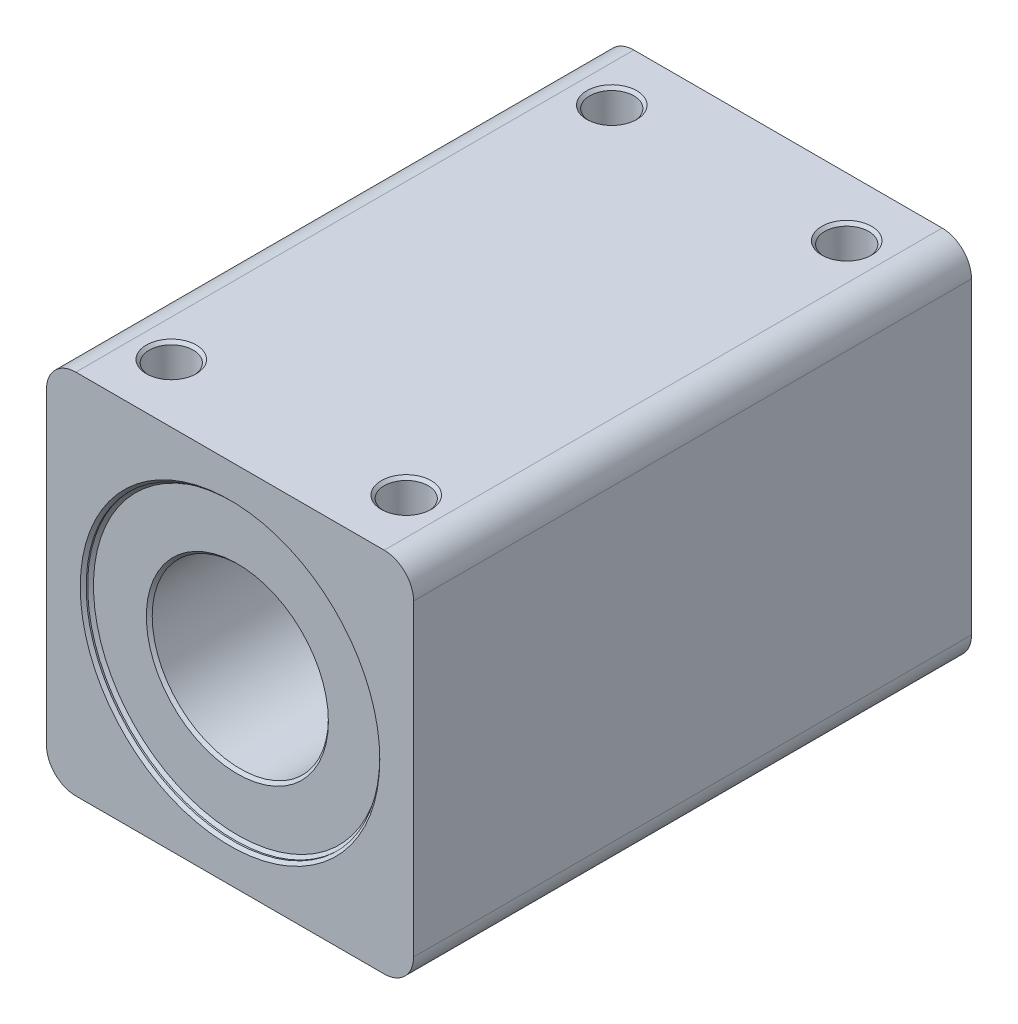
ISO-10303-21;
HEADER;
FILE_DESCRIPTION(('STEP AP214'),'2;1');
FILE_NAME('part.step','',(''),(''),'','','');
FILE_SCHEMA(('AUTOMOTIVE_DESIGN { 1 0 10303 214 1 1 1 1 }'));
ENDSEC;
DATA;
#1=APPLICATION_CONTEXT('core data for automotive mechanical design processes');
#2=APPLICATION_PROTOCOL_DEFINITION('international standard','automotive_design',2000,#1);
#3=PRODUCT_CONTEXT('',#1,'mechanical');
#4=PRODUCT('Part','Part','',(#3));
#5=PRODUCT_RELATED_PRODUCT_CATEGORY('part','',(#4));
#6=PRODUCT_DEFINITION_FORMATION('','',#4);
#7=PRODUCT_DEFINITION_CONTEXT('part definition',#1,'design');
#8=PRODUCT_DEFINITION('design','',#6,#7);
#9=PRODUCT_DEFINITION_SHAPE('','',#8);
#10=(LENGTH_UNIT() NAMED_UNIT(*) SI_UNIT(.MILLI.,.METRE.));
#11=(NAMED_UNIT(*) PLANE_ANGLE_UNIT() SI_UNIT($,.RADIAN.));
#12=(NAMED_UNIT(*) SI_UNIT($,.STERADIAN.) SOLID_ANGLE_UNIT());
#13=UNCERTAINTY_MEASURE_WITH_UNIT(LENGTH_MEASURE(1.E-05),#10,'distance_accuracy_value','');
#14=(GEOMETRIC_REPRESENTATION_CONTEXT(3) GLOBAL_UNCERTAINTY_ASSIGNED_CONTEXT((#13)) GLOBAL_UNIT_ASSIGNED_CONTEXT((#10,
#11,#12)) REPRESENTATION_CONTEXT('',''));
#15=CARTESIAN_POINT('',(0.,0.,0.));
#16=DIRECTION('',(0.,0.,1.));
#17=DIRECTION('',(1.,0.,0.));
#18=AXIS2_PLACEMENT_3D('',#15,#16,#17);
#19=CARTESIAN_POINT('',(0.,0.,19.));
#20=DIRECTION('',(0.,0.,-1.));
#21=DIRECTION('',(-1.,0.,0.));
#22=AXIS2_PLACEMENT_3D('',#19,#20,#21);
#23=CYLINDRICAL_SURFACE('',#22,6.);
#24=CARTESIAN_POINT('',(0.,0.,-18.3));
#25=DIRECTION('',(0.,0.,-1.));
#26=DIRECTION('',(-1.,0.,0.));
#27=AXIS2_PLACEMENT_3D('',#24,#25,#26);
#28=CIRCLE('',#27,6.);
#29=CARTESIAN_POINT('',(-6.,0.,-18.3));
#30=VERTEX_POINT('',#29);
#31=EDGE_CURVE('E162',#30,#30,#28,.T.);
#32=ORIENTED_EDGE('',*,*,#31,.T.);
#33=EDGE_LOOP('',(#32));
#34=FACE_BOUND('',#33,.T.);
#35=CARTESIAN_POINT('',(0.,0.,18.3));
#36=DIRECTION('',(0.,0.,1.));
#37=DIRECTION('',(1.,0.,0.));
#38=AXIS2_PLACEMENT_3D('',#35,#36,#37);
#39=CIRCLE('',#38,6.);
#40=CARTESIAN_POINT('',(6.,0.,18.3));
#41=VERTEX_POINT('',#40);
#42=EDGE_CURVE('E159',#41,#41,#39,.T.);
#43=ORIENTED_EDGE('',*,*,#42,.T.);
#44=EDGE_LOOP('',(#43));
#45=FACE_BOUND('',#44,.T.);
#46=ADVANCED_FACE('F33',(#34,#45),#23,.F.);
#47=CARTESIAN_POINT('',(-12.5,-12.5,19.));
#48=DIRECTION('',(0.,0.,1.));
#49=DIRECTION('',(1.,0.,0.));
#50=AXIS2_PLACEMENT_3D('',#47,#48,#49);
#51=PLANE('',#50);
#52=CARTESIAN_POINT('',(0.,0.,19.));
#53=DIRECTION('',(0.,0.,1.));
#54=DIRECTION('',(1.,0.,0.));
#55=AXIS2_PLACEMENT_3D('',#52,#53,#54);
#56=CIRCLE('',#55,10.2);
#57=CARTESIAN_POINT('',(10.2,0.,19.));
#58=VERTEX_POINT('',#57);
#59=EDGE_CURVE('E41',#58,#58,#56,.F.);
#60=ORIENTED_EDGE('',*,*,#59,.T.);
#61=EDGE_LOOP('',(#60));
#62=FACE_BOUND('',#61,.T.);
#63=DIRECTION('',(0.,1.,0.));
#64=VECTOR('',#63,1.);
#65=CARTESIAN_POINT('',(12.5,12.5,19.));
#66=LINE('',#65,#64);
#67=CARTESIAN_POINT('',(12.5,-10.5,19.));
#68=VERTEX_POINT('',#67);
#69=CARTESIAN_POINT('',(12.5,10.5,19.));
#70=VERTEX_POINT('',#69);
#71=EDGE_CURVE('E334',#68,#70,#66,.T.);
#72=ORIENTED_EDGE('',*,*,#71,.T.);
#73=CARTESIAN_POINT('',(10.5,10.5,19.));
#74=DIRECTION('',(0.,0.,1.));
#75=DIRECTION('',(1.,0.,0.));
#76=AXIS2_PLACEMENT_3D('',#73,#74,#75);
#77=CIRCLE('',#76,2.);
#78=CARTESIAN_POINT('',(10.5,12.5,19.));
#79=VERTEX_POINT('',#78);
#80=EDGE_CURVE('E148',#70,#79,#77,.T.);
#81=ORIENTED_EDGE('',*,*,#80,.T.);
#82=DIRECTION('',(-1.,0.,0.));
#83=VECTOR('',#82,1.);
#84=CARTESIAN_POINT('',(-12.5,12.5,19.));
#85=LINE('',#84,#83);
#86=CARTESIAN_POINT('',(-10.5,12.5,19.));
#87=VERTEX_POINT('',#86);
#88=EDGE_CURVE('E120',#79,#87,#85,.T.);
#89=ORIENTED_EDGE('',*,*,#88,.T.);
#90=CARTESIAN_POINT('',(-10.5,10.5,19.));
#91=DIRECTION('',(0.,0.,1.));
#92=DIRECTION('',(1.,0.,0.));
#93=AXIS2_PLACEMENT_3D('',#90,#91,#92);
#94=CIRCLE('',#93,2.);
#95=CARTESIAN_POINT('',(-12.5,10.5,19.));
#96=VERTEX_POINT('',#95);
#97=EDGE_CURVE('E144',#87,#96,#94,.T.);
#98=ORIENTED_EDGE('',*,*,#97,.T.);
#99=DIRECTION('',(0.,-1.,0.));
#100=VECTOR('',#99,1.);
#101=CARTESIAN_POINT('',(-12.5,12.5,19.));
#102=LINE('',#101,#100);
#103=CARTESIAN_POINT('',(-12.5,-10.5,19.));
#104=VERTEX_POINT('',#103);
#105=EDGE_CURVE('E127',#96,#104,#102,.T.);
#106=ORIENTED_EDGE('',*,*,#105,.T.);
#107=CARTESIAN_POINT('',(-10.5,-10.5,19.));
#108=DIRECTION('',(0.,0.,1.));
#109=DIRECTION('',(1.,0.,0.));
#110=AXIS2_PLACEMENT_3D('',#107,#108,#109);
#111=CIRCLE('',#110,2.);
#112=CARTESIAN_POINT('',(-10.5,-12.5,19.));
#113=VERTEX_POINT('',#112);
#114=EDGE_CURVE('E55',#104,#113,#111,.T.);
#115=ORIENTED_EDGE('',*,*,#114,.T.);
#116=DIRECTION('',(1.,0.,0.));
#117=VECTOR('',#116,1.);
#118=CARTESIAN_POINT('',(-12.5,-12.5,19.));
#119=LINE('',#118,#117);
#120=CARTESIAN_POINT('',(10.5,-12.5,19.));
#121=VERTEX_POINT('',#120);
#122=EDGE_CURVE('E130',#113,#121,#119,.T.);
#123=ORIENTED_EDGE('',*,*,#122,.T.);
#124=CARTESIAN_POINT('',(10.5,-10.5,19.));
#125=DIRECTION('',(0.,0.,1.));
#126=DIRECTION('',(1.,0.,0.));
#127=AXIS2_PLACEMENT_3D('',#124,#125,#126);
#128=CIRCLE('',#127,2.);
#129=EDGE_CURVE('E146',#121,#68,#128,.T.);
#130=ORIENTED_EDGE('',*,*,#129,.T.);
#131=EDGE_LOOP('',(#72,#81,#89,#98,#106,#115,#123,#130));
#132=FACE_BOUND('',#131,.T.);
#133=ADVANCED_FACE('F215',(#62,#132),#51,.T.);
#134=CARTESIAN_POINT('',(-12.5,-12.5,-19.));
#135=DIRECTION('',(0.,0.,1.));
#136=DIRECTION('',(1.,0.,0.));
#137=AXIS2_PLACEMENT_3D('',#134,#135,#136);
#138=PLANE('',#137);
#139=CARTESIAN_POINT('',(0.,0.,-19.));
#140=DIRECTION('',(0.,0.,1.));
#141=DIRECTION('',(1.,0.,0.));
#142=AXIS2_PLACEMENT_3D('',#139,#140,#141);
#143=CIRCLE('',#142,10.2);
#144=CARTESIAN_POINT('',(10.2,0.,-19.));
#145=VERTEX_POINT('',#144);
#146=EDGE_CURVE('E11',#145,#145,#143,.T.);
#147=ORIENTED_EDGE('',*,*,#146,.T.);
#148=EDGE_LOOP('',(#147));
#149=FACE_BOUND('',#148,.T.);
#150=DIRECTION('',(-1.,0.,0.));
#151=VECTOR('',#150,1.);
#152=CARTESIAN_POINT('',(-12.5,12.5,-19.));
#153=LINE('',#152,#151);
#154=CARTESIAN_POINT('',(10.5,12.5,-19.));
#155=VERTEX_POINT('',#154);
#156=CARTESIAN_POINT('',(-10.5,12.5,-19.));
#157=VERTEX_POINT('',#156);
#158=EDGE_CURVE('E117',#155,#157,#153,.T.);
#159=ORIENTED_EDGE('',*,*,#158,.F.);
#160=CARTESIAN_POINT('',(10.5,10.5,-19.));
#161=DIRECTION('',(0.,0.,1.));
#162=DIRECTION('',(1.,0.,0.));
#163=AXIS2_PLACEMENT_3D('',#160,#161,#162);
#164=CIRCLE('',#163,2.);
#165=CARTESIAN_POINT('',(12.5,10.5,-19.));
#166=VERTEX_POINT('',#165);
#167=EDGE_CURVE('E100',#155,#166,#164,.F.);
#168=ORIENTED_EDGE('',*,*,#167,.T.);
#169=DIRECTION('',(0.,1.,0.));
#170=VECTOR('',#169,1.);
#171=CARTESIAN_POINT('',(12.5,12.5,-19.));
#172=LINE('',#171,#170);
#173=CARTESIAN_POINT('',(12.5,-10.5,-19.));
#174=VERTEX_POINT('',#173);
#175=EDGE_CURVE('E128',#174,#166,#172,.T.);
#176=ORIENTED_EDGE('',*,*,#175,.F.);
#177=CARTESIAN_POINT('',(10.5,-10.5,-19.));
#178=DIRECTION('',(0.,0.,1.));
#179=DIRECTION('',(1.,0.,0.));
#180=AXIS2_PLACEMENT_3D('',#177,#178,#179);
#181=CIRCLE('',#180,2.);
#182=CARTESIAN_POINT('',(10.5,-12.5,-19.));
#183=VERTEX_POINT('',#182);
#184=EDGE_CURVE('E111',#174,#183,#181,.F.);
#185=ORIENTED_EDGE('',*,*,#184,.T.);
#186=DIRECTION('',(1.,0.,0.));
#187=VECTOR('',#186,1.);
#188=CARTESIAN_POINT('',(-12.5,-12.5,-19.));
#189=LINE('',#188,#187);
#190=CARTESIAN_POINT('',(-10.5,-12.5,-19.));
#191=VERTEX_POINT('',#190);
#192=EDGE_CURVE('E132',#191,#183,#189,.T.);
#193=ORIENTED_EDGE('',*,*,#192,.F.);
#194=CARTESIAN_POINT('',(-10.5,-10.5,-19.));
#195=DIRECTION('',(0.,0.,1.));
#196=DIRECTION('',(1.,0.,0.));
#197=AXIS2_PLACEMENT_3D('',#194,#195,#196);
#198=CIRCLE('',#197,2.);
#199=CARTESIAN_POINT('',(-12.5,-10.5,-19.));
#200=VERTEX_POINT('',#199);
#201=EDGE_CURVE('E121',#191,#200,#198,.F.);
#202=ORIENTED_EDGE('',*,*,#201,.T.);
#203=DIRECTION('',(0.,-1.,0.));
#204=VECTOR('',#203,1.);
#205=CARTESIAN_POINT('',(-12.5,12.5,-19.));
#206=LINE('',#205,#204);
#207=CARTESIAN_POINT('',(-12.5,10.5,-19.));
#208=VERTEX_POINT('',#207);
#209=EDGE_CURVE('E321',#208,#200,#206,.T.);
#210=ORIENTED_EDGE('',*,*,#209,.F.);
#211=CARTESIAN_POINT('',(-10.5,10.5,-19.));
#212=DIRECTION('',(0.,0.,1.));
#213=DIRECTION('',(1.,0.,0.));
#214=AXIS2_PLACEMENT_3D('',#211,#212,#213);
#215=CIRCLE('',#214,2.);
#216=EDGE_CURVE('E126',#208,#157,#215,.F.);
#217=ORIENTED_EDGE('',*,*,#216,.T.);
#218=EDGE_LOOP('',(#159,#168,#176,#185,#193,#202,#210,#217));
#219=FACE_BOUND('',#218,.T.);
#220=ADVANCED_FACE('F124',(#149,#219),#138,.F.);
#221=CARTESIAN_POINT('',(-12.5,12.5,19.));
#222=DIRECTION('',(1.,0.,0.));
#223=DIRECTION('',(0.,1.,0.));
#224=AXIS2_PLACEMENT_3D('',#221,#222,#223);
#225=PLANE('',#224);
#226=ORIENTED_EDGE('',*,*,#105,.F.);
#227=DIRECTION('',(0.,0.,-1.));
#228=VECTOR('',#227,1.);
#229=CARTESIAN_POINT('',(-12.5,10.5,19.));
#230=LINE('',#229,#228);
#231=EDGE_CURVE('E156',#96,#208,#230,.T.);
#232=ORIENTED_EDGE('',*,*,#231,.T.);
#233=ORIENTED_EDGE('',*,*,#209,.T.);
#234=DIRECTION('',(0.,0.,-1.));
#235=VECTOR('',#234,1.);
#236=CARTESIAN_POINT('',(-12.5,-10.5,19.));
#237=LINE('',#236,#235);
#238=EDGE_CURVE('E154',#200,#104,#237,.F.);
#239=ORIENTED_EDGE('',*,*,#238,.T.);
#240=EDGE_LOOP('',(#226,#232,#233,#239));
#241=FACE_BOUND('',#240,.T.);
#242=ADVANCED_FACE('F248',(#241),#225,.F.);
#243=CARTESIAN_POINT('',(-12.5,-12.5,19.));
#244=DIRECTION('',(0.,1.,0.));
#245=DIRECTION('',(0.,0.,1.));
#246=AXIS2_PLACEMENT_3D('',#243,#244,#245);
#247=PLANE('',#246);
#248=ORIENTED_EDGE('',*,*,#192,.T.);
#249=DIRECTION('',(0.,0.,-1.));
#250=VECTOR('',#249,1.);
#251=CARTESIAN_POINT('',(10.5,-12.5,19.));
#252=LINE('',#251,#250);
#253=EDGE_CURVE('E48',#183,#121,#252,.F.);
#254=ORIENTED_EDGE('',*,*,#253,.T.);
#255=ORIENTED_EDGE('',*,*,#122,.F.);
#256=DIRECTION('',(0.,0.,-1.));
#257=VECTOR('',#256,1.);
#258=CARTESIAN_POINT('',(-10.5,-12.5,19.));
#259=LINE('',#258,#257);
#260=EDGE_CURVE('E150',#113,#191,#259,.T.);
#261=ORIENTED_EDGE('',*,*,#260,.T.);
#262=EDGE_LOOP('',(#248,#254,#255,#261));
#263=FACE_BOUND('',#262,.T.);
#264=ADVANCED_FACE('F253',(#263),#247,.F.);
#265=CARTESIAN_POINT('',(12.5,12.5,19.));
#266=DIRECTION('',(-1.,0.,0.));
#267=DIRECTION('',(0.,-1.,0.));
#268=AXIS2_PLACEMENT_3D('',#265,#266,#267);
#269=PLANE('',#268);
#270=ORIENTED_EDGE('',*,*,#175,.T.);
#271=DIRECTION('',(0.,0.,-1.));
#272=VECTOR('',#271,1.);
#273=CARTESIAN_POINT('',(12.5,10.5,19.));
#274=LINE('',#273,#272);
#275=EDGE_CURVE('E105',#166,#70,#274,.F.);
#276=ORIENTED_EDGE('',*,*,#275,.T.);
#277=ORIENTED_EDGE('',*,*,#71,.F.);
#278=DIRECTION('',(0.,0.,-1.));
#279=VECTOR('',#278,1.);
#280=CARTESIAN_POINT('',(12.5,-10.5,19.));
#281=LINE('',#280,#279);
#282=EDGE_CURVE('E110',#68,#174,#281,.T.);
#283=ORIENTED_EDGE('',*,*,#282,.T.);
#284=EDGE_LOOP('',(#270,#276,#277,#283));
#285=FACE_BOUND('',#284,.T.);
#286=ADVANCED_FACE('F235',(#285),#269,.F.);
#287=CARTESIAN_POINT('',(-12.5,12.5,19.));
#288=DIRECTION('',(0.,-1.,0.));
#289=DIRECTION('',(0.,0.,-1.));
#290=AXIS2_PLACEMENT_3D('',#287,#288,#289);
#291=PLANE('',#290);
#292=CARTESIAN_POINT('',(-8.,12.5,15.));
#293=DIRECTION('',(0.,-1.,0.));
#294=DIRECTION('',(0.,0.,-1.));
#295=AXIS2_PLACEMENT_3D('',#292,#293,#294);
#296=CIRCLE('',#295,1.7);
#297=CARTESIAN_POINT('',(-8.,12.5,13.3));
#298=VERTEX_POINT('',#297);
#299=EDGE_CURVE('E201',#298,#298,#296,.T.);
#300=ORIENTED_EDGE('',*,*,#299,.T.);
#301=EDGE_LOOP('',(#300));
#302=FACE_BOUND('',#301,.T.);
#303=CARTESIAN_POINT('',(-8.,12.5,-15.));
#304=DIRECTION('',(0.,-1.,0.));
#305=DIRECTION('',(0.,0.,-1.));
#306=AXIS2_PLACEMENT_3D('',#303,#304,#305);
#307=CIRCLE('',#306,1.7);
#308=CARTESIAN_POINT('',(-8.,12.5,-16.7));
#309=VERTEX_POINT('',#308);
#310=EDGE_CURVE('E198',#309,#309,#307,.T.);
#311=ORIENTED_EDGE('',*,*,#310,.T.);
#312=EDGE_LOOP('',(#311));
#313=FACE_BOUND('',#312,.T.);
#314=CARTESIAN_POINT('',(8.,12.5,-15.));
#315=DIRECTION('',(0.,-1.,0.));
#316=DIRECTION('',(0.,0.,-1.));
#317=AXIS2_PLACEMENT_3D('',#314,#315,#316);
#318=CIRCLE('',#317,1.7);
#319=CARTESIAN_POINT('',(8.,12.5,-16.7));
#320=VERTEX_POINT('',#319);
#321=EDGE_CURVE('E195',#320,#320,#318,.T.);
#322=ORIENTED_EDGE('',*,*,#321,.T.);
#323=EDGE_LOOP('',(#322));
#324=FACE_BOUND('',#323,.T.);
#325=CARTESIAN_POINT('',(8.,12.5,15.));
#326=DIRECTION('',(0.,-1.,0.));
#327=DIRECTION('',(0.,0.,-1.));
#328=AXIS2_PLACEMENT_3D('',#325,#326,#327);
#329=CIRCLE('',#328,1.7);
#330=CARTESIAN_POINT('',(8.,12.5,13.3));
#331=VERTEX_POINT('',#330);
#332=EDGE_CURVE('E192',#331,#331,#329,.T.);
#333=ORIENTED_EDGE('',*,*,#332,.T.);
#334=EDGE_LOOP('',(#333));
#335=FACE_BOUND('',#334,.T.);
#336=ORIENTED_EDGE('',*,*,#88,.F.);
#337=DIRECTION('',(0.,0.,-1.));
#338=VECTOR('',#337,1.);
#339=CARTESIAN_POINT('',(10.5,12.5,19.));
#340=LINE('',#339,#338);
#341=EDGE_CURVE('E104',#79,#155,#340,.T.);
#342=ORIENTED_EDGE('',*,*,#341,.T.);
#343=ORIENTED_EDGE('',*,*,#158,.T.);
#344=DIRECTION('',(0.,0.,-1.));
#345=VECTOR('',#344,1.);
#346=CARTESIAN_POINT('',(-10.5,12.5,19.));
#347=LINE('',#346,#345);
#348=EDGE_CURVE('E122',#157,#87,#347,.F.);
#349=ORIENTED_EDGE('',*,*,#348,.T.);
#350=EDGE_LOOP('',(#336,#342,#343,#349));
#351=FACE_BOUND('',#350,.T.);
#352=ADVANCED_FACE('F116',(#302,#313,#324,#335,#351),#291,.F.);
#353=CARTESIAN_POINT('',(0.,0.,18.5));
#354=DIRECTION('',(0.,0.,1.));
#355=DIRECTION('',(1.,0.,0.));
#356=AXIS2_PLACEMENT_3D('',#353,#354,#355);
#357=CYLINDRICAL_SURFACE('',#356,10.);
#358=CARTESIAN_POINT('',(0.,0.,18.7));
#359=DIRECTION('',(0.,0.,1.));
#360=DIRECTION('',(1.,0.,0.));
#361=AXIS2_PLACEMENT_3D('',#358,#359,#360);
#362=CIRCLE('',#361,10.);
#363=CARTESIAN_POINT('',(10.,0.,18.7));
#364=VERTEX_POINT('',#363);
#365=EDGE_CURVE('E186',#364,#364,#362,.F.);
#366=ORIENTED_EDGE('',*,*,#365,.T.);
#367=EDGE_LOOP('',(#366));
#368=FACE_BOUND('',#367,.T.);
#369=CARTESIAN_POINT('',(0.,0.,18.8));
#370=DIRECTION('',(0.,0.,1.));
#371=DIRECTION('',(1.,0.,0.));
#372=AXIS2_PLACEMENT_3D('',#369,#370,#371);
#373=CIRCLE('',#372,10.);
#374=CARTESIAN_POINT('',(10.,0.,18.8));
#375=VERTEX_POINT('',#374);
#376=EDGE_CURVE('E183',#375,#375,#373,.T.);
#377=ORIENTED_EDGE('',*,*,#376,.T.);
#378=EDGE_LOOP('',(#377));
#379=FACE_BOUND('',#378,.T.);
#380=ADVANCED_FACE('F223',(#368,#379),#357,.F.);
#381=CARTESIAN_POINT('',(0.,0.,18.5));
#382=DIRECTION('',(0.,0.,1.));
#383=DIRECTION('',(1.,0.,0.));
#384=AXIS2_PLACEMENT_3D('',#381,#382,#383);
#385=PLANE('',#384);
#386=CARTESIAN_POINT('',(0.,0.,18.5));
#387=DIRECTION('',(0.,0.,1.));
#388=DIRECTION('',(1.,0.,0.));
#389=AXIS2_PLACEMENT_3D('',#386,#387,#388);
#390=CIRCLE('',#389,6.2);
#391=CARTESIAN_POINT('',(6.2,0.,18.5));
#392=VERTEX_POINT('',#391);
#393=EDGE_CURVE('E174',#392,#392,#390,.F.);
#394=ORIENTED_EDGE('',*,*,#393,.T.);
#395=EDGE_LOOP('',(#394));
#396=FACE_BOUND('',#395,.T.);
#397=CARTESIAN_POINT('',(0.,0.,18.5));
#398=DIRECTION('',(0.,0.,1.));
#399=DIRECTION('',(1.,0.,0.));
#400=AXIS2_PLACEMENT_3D('',#397,#398,#399);
#401=CIRCLE('',#400,9.8);
#402=CARTESIAN_POINT('',(9.8,0.,18.5));
#403=VERTEX_POINT('',#402);
#404=EDGE_CURVE('E171',#403,#403,#401,.T.);
#405=ORIENTED_EDGE('',*,*,#404,.T.);
#406=EDGE_LOOP('',(#405));
#407=FACE_BOUND('',#406,.T.);
#408=ADVANCED_FACE('F225',(#396,#407),#385,.T.);
#409=CARTESIAN_POINT('',(0.,0.,-18.5));
#410=DIRECTION('',(0.,0.,-1.));
#411=DIRECTION('',(-1.,0.,0.));
#412=AXIS2_PLACEMENT_3D('',#409,#410,#411);
#413=CYLINDRICAL_SURFACE('',#412,10.);
#414=CARTESIAN_POINT('',(0.,0.,-18.7));
#415=DIRECTION('',(0.,0.,-1.));
#416=DIRECTION('',(-1.,0.,0.));
#417=AXIS2_PLACEMENT_3D('',#414,#415,#416);
#418=CIRCLE('',#417,10.);
#419=CARTESIAN_POINT('',(-10.,0.,-18.7));
#420=VERTEX_POINT('',#419);
#421=EDGE_CURVE('E180',#420,#420,#418,.F.);
#422=ORIENTED_EDGE('',*,*,#421,.T.);
#423=EDGE_LOOP('',(#422));
#424=FACE_BOUND('',#423,.T.);
#425=CARTESIAN_POINT('',(0.,0.,-18.8));
#426=DIRECTION('',(0.,0.,1.));
#427=DIRECTION('',(1.,0.,0.));
#428=AXIS2_PLACEMENT_3D('',#425,#426,#427);
#429=CIRCLE('',#428,10.);
#430=CARTESIAN_POINT('',(10.,0.,-18.8));
#431=VERTEX_POINT('',#430);
#432=EDGE_CURVE('E177',#431,#431,#429,.F.);
#433=ORIENTED_EDGE('',*,*,#432,.T.);
#434=EDGE_LOOP('',(#433));
#435=FACE_BOUND('',#434,.T.);
#436=ADVANCED_FACE('F232',(#424,#435),#413,.F.);
#437=CARTESIAN_POINT('',(0.,0.,-18.5));
#438=DIRECTION('',(0.,0.,-1.));
#439=DIRECTION('',(1.,0.,0.));
#440=AXIS2_PLACEMENT_3D('',#437,#438,#439);
#441=PLANE('',#440);
#442=CARTESIAN_POINT('',(0.,0.,-18.5));
#443=DIRECTION('',(0.,0.,-1.));
#444=DIRECTION('',(-1.,0.,0.));
#445=AXIS2_PLACEMENT_3D('',#442,#443,#444);
#446=CIRCLE('',#445,6.2);
#447=CARTESIAN_POINT('',(-6.2,0.,-18.5));
#448=VERTEX_POINT('',#447);
#449=EDGE_CURVE('E168',#448,#448,#446,.F.);
#450=ORIENTED_EDGE('',*,*,#449,.T.);
#451=EDGE_LOOP('',(#450));
#452=FACE_BOUND('',#451,.T.);
#453=CARTESIAN_POINT('',(0.,0.,-18.5));
#454=DIRECTION('',(0.,0.,-1.));
#455=DIRECTION('',(-1.,0.,0.));
#456=AXIS2_PLACEMENT_3D('',#453,#454,#455);
#457=CIRCLE('',#456,9.8);
#458=CARTESIAN_POINT('',(-9.8,0.,-18.5));
#459=VERTEX_POINT('',#458);
#460=EDGE_CURVE('E165',#459,#459,#457,.T.);
#461=ORIENTED_EDGE('',*,*,#460,.T.);
#462=EDGE_LOOP('',(#461));
#463=FACE_BOUND('',#462,.T.);
#464=ADVANCED_FACE('F263',(#452,#463),#441,.T.);
#465=CARTESIAN_POINT('',(10.5,10.5,19.));
#466=DIRECTION('',(0.,0.,-1.));
#467=DIRECTION('',(-1.,0.,0.));
#468=AXIS2_PLACEMENT_3D('',#465,#466,#467);
#469=CYLINDRICAL_SURFACE('',#468,2.);
#470=ORIENTED_EDGE('',*,*,#80,.F.);
#471=ORIENTED_EDGE('',*,*,#275,.F.);
#472=ORIENTED_EDGE('',*,*,#167,.F.);
#473=ORIENTED_EDGE('',*,*,#341,.F.);
#474=EDGE_LOOP('',(#470,#471,#472,#473));
#475=FACE_BOUND('',#474,.T.);
#476=ADVANCED_FACE('F103',(#475),#469,.T.);
#477=CARTESIAN_POINT('',(10.5,-10.5,19.));
#478=DIRECTION('',(0.,0.,-1.));
#479=DIRECTION('',(-1.,0.,0.));
#480=AXIS2_PLACEMENT_3D('',#477,#478,#479);
#481=CYLINDRICAL_SURFACE('',#480,2.);
#482=ORIENTED_EDGE('',*,*,#129,.F.);
#483=ORIENTED_EDGE('',*,*,#253,.F.);
#484=ORIENTED_EDGE('',*,*,#184,.F.);
#485=ORIENTED_EDGE('',*,*,#282,.F.);
#486=EDGE_LOOP('',(#482,#483,#484,#485));
#487=FACE_BOUND('',#486,.T.);
#488=ADVANCED_FACE('F262',(#487),#481,.T.);
#489=CARTESIAN_POINT('',(-10.5,10.5,19.));
#490=DIRECTION('',(0.,0.,-1.));
#491=DIRECTION('',(-1.,0.,0.));
#492=AXIS2_PLACEMENT_3D('',#489,#490,#491);
#493=CYLINDRICAL_SURFACE('',#492,2.);
#494=ORIENTED_EDGE('',*,*,#97,.F.);
#495=ORIENTED_EDGE('',*,*,#348,.F.);
#496=ORIENTED_EDGE('',*,*,#216,.F.);
#497=ORIENTED_EDGE('',*,*,#231,.F.);
#498=EDGE_LOOP('',(#494,#495,#496,#497));
#499=FACE_BOUND('',#498,.T.);
#500=ADVANCED_FACE('F266',(#499),#493,.T.);
#501=CARTESIAN_POINT('',(-10.5,-10.5,19.));
#502=DIRECTION('',(0.,0.,-1.));
#503=DIRECTION('',(-1.,0.,0.));
#504=AXIS2_PLACEMENT_3D('',#501,#502,#503);
#505=CYLINDRICAL_SURFACE('',#504,2.);
#506=ORIENTED_EDGE('',*,*,#114,.F.);
#507=ORIENTED_EDGE('',*,*,#238,.F.);
#508=ORIENTED_EDGE('',*,*,#201,.F.);
#509=ORIENTED_EDGE('',*,*,#260,.F.);
#510=EDGE_LOOP('',(#506,#507,#508,#509));
#511=FACE_BOUND('',#510,.T.);
#512=ADVANCED_FACE('F270',(#511),#505,.T.);
#513=CARTESIAN_POINT('',(8.,8.,15.));
#514=DIRECTION('',(0.,1.,0.));
#515=DIRECTION('',(0.,0.,1.));
#516=AXIS2_PLACEMENT_3D('',#513,#514,#515);
#517=CYLINDRICAL_SURFACE('',#516,1.5);
#518=CARTESIAN_POINT('',(8.,12.3,15.));
#519=DIRECTION('',(0.,-1.,0.));
#520=DIRECTION('',(0.,0.,-1.));
#521=AXIS2_PLACEMENT_3D('',#518,#519,#520);
#522=CIRCLE('',#521,1.5);
#523=CARTESIAN_POINT('',(8.,12.3,13.5));
#524=VERTEX_POINT('',#523);
#525=EDGE_CURVE('E210',#524,#524,#522,.F.);
#526=ORIENTED_EDGE('',*,*,#525,.T.);
#527=EDGE_LOOP('',(#526));
#528=FACE_BOUND('',#527,.T.);
#529=CARTESIAN_POINT('',(8.,8.,15.));
#530=DIRECTION('',(0.,1.,0.));
#531=DIRECTION('',(0.,0.,1.));
#532=AXIS2_PLACEMENT_3D('',#529,#530,#531);
#533=CIRCLE('',#532,1.5);
#534=CARTESIAN_POINT('',(8.,8.,16.5));
#535=VERTEX_POINT('',#534);
#536=EDGE_CURVE('E319',#535,#535,#533,.T.);
#537=ORIENTED_EDGE('',*,*,#536,.F.);
#538=EDGE_LOOP('',(#537));
#539=FACE_BOUND('',#538,.T.);
#540=ADVANCED_FACE('F274',(#528,#539),#517,.F.);
#541=CARTESIAN_POINT('',(8.,8.,15.));
#542=DIRECTION('',(0.,1.,0.));
#543=DIRECTION('',(0.,0.,1.));
#544=AXIS2_PLACEMENT_3D('',#541,#542,#543);
#545=PLANE('',#544);
#546=ORIENTED_EDGE('',*,*,#536,.T.);
#547=EDGE_LOOP('',(#546));
#548=FACE_BOUND('',#547,.T.);
#549=ADVANCED_FACE('F315',(#548),#545,.T.);
#550=CARTESIAN_POINT('',(-8.,8.,-15.));
#551=DIRECTION('',(0.,1.,0.));
#552=DIRECTION('',(0.,0.,1.));
#553=AXIS2_PLACEMENT_3D('',#550,#551,#552);
#554=CYLINDRICAL_SURFACE('',#553,1.5);
#555=CARTESIAN_POINT('',(-8.,12.3,-15.));
#556=DIRECTION('',(0.,-1.,0.));
#557=DIRECTION('',(0.,0.,-1.));
#558=AXIS2_PLACEMENT_3D('',#555,#556,#557);
#559=CIRCLE('',#558,1.5);
#560=CARTESIAN_POINT('',(-8.,12.3,-16.5));
#561=VERTEX_POINT('',#560);
#562=EDGE_CURVE('E204',#561,#561,#559,.F.);
#563=ORIENTED_EDGE('',*,*,#562,.T.);
#564=EDGE_LOOP('',(#563));
#565=FACE_BOUND('',#564,.T.);
#566=CARTESIAN_POINT('',(-8.,8.,-15.));
#567=DIRECTION('',(0.,1.,0.));
#568=DIRECTION('',(0.,0.,1.));
#569=AXIS2_PLACEMENT_3D('',#566,#567,#568);
#570=CIRCLE('',#569,1.5);
#571=CARTESIAN_POINT('',(-8.,8.,-13.5));
#572=VERTEX_POINT('',#571);
#573=EDGE_CURVE('E330',#572,#572,#570,.T.);
#574=ORIENTED_EDGE('',*,*,#573,.F.);
#575=EDGE_LOOP('',(#574));
#576=FACE_BOUND('',#575,.T.);
#577=ADVANCED_FACE('F363',(#565,#576),#554,.F.);
#578=CARTESIAN_POINT('',(-8.,8.,-15.));
#579=DIRECTION('',(0.,1.,0.));
#580=DIRECTION('',(0.,0.,1.));
#581=AXIS2_PLACEMENT_3D('',#578,#579,#580);
#582=PLANE('',#581);
#583=ORIENTED_EDGE('',*,*,#573,.T.);
#584=EDGE_LOOP('',(#583));
#585=FACE_BOUND('',#584,.T.);
#586=ADVANCED_FACE('F354',(#585),#582,.T.);
#587=CARTESIAN_POINT('',(8.,8.,-15.));
#588=DIRECTION('',(0.,1.,0.));
#589=DIRECTION('',(0.,0.,1.));
#590=AXIS2_PLACEMENT_3D('',#587,#588,#589);
#591=CYLINDRICAL_SURFACE('',#590,1.5);
#592=CARTESIAN_POINT('',(8.,12.3,-15.));
#593=DIRECTION('',(0.,-1.,0.));
#594=DIRECTION('',(0.,0.,-1.));
#595=AXIS2_PLACEMENT_3D('',#592,#593,#594);
#596=CIRCLE('',#595,1.5);
#597=CARTESIAN_POINT('',(8.,12.3,-16.5));
#598=VERTEX_POINT('',#597);
#599=EDGE_CURVE('E207',#598,#598,#596,.F.);
#600=ORIENTED_EDGE('',*,*,#599,.T.);
#601=EDGE_LOOP('',(#600));
#602=FACE_BOUND('',#601,.T.);
#603=CARTESIAN_POINT('',(8.,8.,-15.));
#604=DIRECTION('',(0.,1.,0.));
#605=DIRECTION('',(0.,0.,1.));
#606=AXIS2_PLACEMENT_3D('',#603,#604,#605);
#607=CIRCLE('',#606,1.5);
#608=CARTESIAN_POINT('',(8.,8.,-13.5));
#609=VERTEX_POINT('',#608);
#610=EDGE_CURVE('E327',#609,#609,#607,.T.);
#611=ORIENTED_EDGE('',*,*,#610,.F.);
#612=EDGE_LOOP('',(#611));
#613=FACE_BOUND('',#612,.T.);
#614=ADVANCED_FACE('F352',(#602,#613),#591,.F.);
#615=CARTESIAN_POINT('',(8.,8.,-15.));
#616=DIRECTION('',(0.,1.,0.));
#617=DIRECTION('',(0.,0.,1.));
#618=AXIS2_PLACEMENT_3D('',#615,#616,#617);
#619=PLANE('',#618);
#620=ORIENTED_EDGE('',*,*,#610,.T.);
#621=EDGE_LOOP('',(#620));
#622=FACE_BOUND('',#621,.T.);
#623=ADVANCED_FACE('F350',(#622),#619,.T.);
#624=CARTESIAN_POINT('',(-8.,8.,15.));
#625=DIRECTION('',(0.,1.,0.));
#626=DIRECTION('',(0.,0.,1.));
#627=AXIS2_PLACEMENT_3D('',#624,#625,#626);
#628=CYLINDRICAL_SURFACE('',#627,1.5);
#629=CARTESIAN_POINT('',(-8.,12.3,15.));
#630=DIRECTION('',(0.,-1.,0.));
#631=DIRECTION('',(0.,0.,-1.));
#632=AXIS2_PLACEMENT_3D('',#629,#630,#631);
#633=CIRCLE('',#632,1.5);
#634=CARTESIAN_POINT('',(-8.,12.3,13.5));
#635=VERTEX_POINT('',#634);
#636=EDGE_CURVE('E189',#635,#635,#633,.F.);
#637=ORIENTED_EDGE('',*,*,#636,.T.);
#638=EDGE_LOOP('',(#637));
#639=FACE_BOUND('',#638,.T.);
#640=CARTESIAN_POINT('',(-8.,8.,15.));
#641=DIRECTION('',(0.,1.,0.));
#642=DIRECTION('',(0.,0.,1.));
#643=AXIS2_PLACEMENT_3D('',#640,#641,#642);
#644=CIRCLE('',#643,1.5);
#645=CARTESIAN_POINT('',(-8.,8.,16.5));
#646=VERTEX_POINT('',#645);
#647=EDGE_CURVE('E322',#646,#646,#644,.T.);
#648=ORIENTED_EDGE('',*,*,#647,.F.);
#649=EDGE_LOOP('',(#648));
#650=FACE_BOUND('',#649,.T.);
#651=ADVANCED_FACE('F361',(#639,#650),#628,.F.);
#652=CARTESIAN_POINT('',(-8.,8.,15.));
#653=DIRECTION('',(0.,1.,0.));
#654=DIRECTION('',(0.,0.,1.));
#655=AXIS2_PLACEMENT_3D('',#652,#653,#654);
#656=PLANE('',#655);
#657=ORIENTED_EDGE('',*,*,#647,.T.);
#658=EDGE_LOOP('',(#657));
#659=FACE_BOUND('',#658,.T.);
#660=ADVANCED_FACE('F280',(#659),#656,.T.);
#661=CARTESIAN_POINT('',(0.,0.,-18.3));
#662=DIRECTION('',(0.,0.,-1.));
#663=DIRECTION('',(-1.,0.,0.));
#664=AXIS2_PLACEMENT_3D('',#661,#662,#663);
#665=CONICAL_SURFACE('',#664,6.,0.785398163397448);
#666=ORIENTED_EDGE('',*,*,#449,.F.);
#667=EDGE_LOOP('',(#666));
#668=FACE_BOUND('',#667,.T.);
#669=ORIENTED_EDGE('',*,*,#31,.F.);
#670=EDGE_LOOP('',(#669));
#671=FACE_BOUND('',#670,.T.);
#672=ADVANCED_FACE('F276',(#668,#671),#665,.F.);
#673=CARTESIAN_POINT('',(0.,0.,18.3));
#674=DIRECTION('',(0.,0.,1.));
#675=DIRECTION('',(1.,0.,0.));
#676=AXIS2_PLACEMENT_3D('',#673,#674,#675);
#677=CONICAL_SURFACE('',#676,6.,0.78539816339745);
#678=ORIENTED_EDGE('',*,*,#393,.F.);
#679=EDGE_LOOP('',(#678));
#680=FACE_BOUND('',#679,.T.);
#681=ORIENTED_EDGE('',*,*,#42,.F.);
#682=EDGE_LOOP('',(#681));
#683=FACE_BOUND('',#682,.T.);
#684=ADVANCED_FACE('F279',(#680,#683),#677,.F.);
#685=CARTESIAN_POINT('',(0.,0.,-18.7));
#686=DIRECTION('',(0.,0.,-1.));
#687=DIRECTION('',(-1.,0.,0.));
#688=AXIS2_PLACEMENT_3D('',#685,#686,#687);
#689=CONICAL_SURFACE('',#688,10.,0.78539816339744);
#690=ORIENTED_EDGE('',*,*,#460,.F.);
#691=EDGE_LOOP('',(#690));
#692=FACE_BOUND('',#691,.T.);
#693=ORIENTED_EDGE('',*,*,#421,.F.);
#694=EDGE_LOOP('',(#693));
#695=FACE_BOUND('',#694,.T.);
#696=ADVANCED_FACE('F284',(#692,#695),#689,.F.);
#697=CARTESIAN_POINT('',(0.,0.,18.5));
#698=DIRECTION('',(0.,0.,1.));
#699=DIRECTION('',(1.,0.,0.));
#700=AXIS2_PLACEMENT_3D('',#697,#698,#699);
#701=CONICAL_SURFACE('',#700,9.8,0.785398163397457);
#702=ORIENTED_EDGE('',*,*,#365,.F.);
#703=EDGE_LOOP('',(#702));
#704=FACE_BOUND('',#703,.T.);
#705=ORIENTED_EDGE('',*,*,#404,.F.);
#706=EDGE_LOOP('',(#705));
#707=FACE_BOUND('',#706,.T.);
#708=ADVANCED_FACE('F288',(#704,#707),#701,.F.);
#709=CARTESIAN_POINT('',(-8.,12.3,15.));
#710=DIRECTION('',(0.,1.,0.));
#711=DIRECTION('',(0.,0.,1.));
#712=AXIS2_PLACEMENT_3D('',#709,#710,#711);
#713=CONICAL_SURFACE('',#712,1.5,0.785398163397442);
#714=ORIENTED_EDGE('',*,*,#299,.F.);
#715=EDGE_LOOP('',(#714));
#716=FACE_BOUND('',#715,.T.);
#717=ORIENTED_EDGE('',*,*,#636,.F.);
#718=EDGE_LOOP('',(#717));
#719=FACE_BOUND('',#718,.T.);
#720=ADVANCED_FACE('F292',(#716,#719),#713,.F.);
#721=CARTESIAN_POINT('',(-8.,12.3,-15.));
#722=DIRECTION('',(0.,1.,0.));
#723=DIRECTION('',(0.,0.,1.));
#724=AXIS2_PLACEMENT_3D('',#721,#722,#723);
#725=CONICAL_SURFACE('',#724,1.5,0.78539816339745);
#726=ORIENTED_EDGE('',*,*,#310,.F.);
#727=EDGE_LOOP('',(#726));
#728=FACE_BOUND('',#727,.T.);
#729=ORIENTED_EDGE('',*,*,#562,.F.);
#730=EDGE_LOOP('',(#729));
#731=FACE_BOUND('',#730,.T.);
#732=ADVANCED_FACE('F296',(#728,#731),#725,.F.);
#733=CARTESIAN_POINT('',(8.,12.3,-15.));
#734=DIRECTION('',(0.,1.,0.));
#735=DIRECTION('',(0.,0.,1.));
#736=AXIS2_PLACEMENT_3D('',#733,#734,#735);
#737=CONICAL_SURFACE('',#736,1.5,0.785398163397448);
#738=ORIENTED_EDGE('',*,*,#321,.F.);
#739=EDGE_LOOP('',(#738));
#740=FACE_BOUND('',#739,.T.);
#741=ORIENTED_EDGE('',*,*,#599,.F.);
#742=EDGE_LOOP('',(#741));
#743=FACE_BOUND('',#742,.T.);
#744=ADVANCED_FACE('F300',(#740,#743),#737,.F.);
#745=CARTESIAN_POINT('',(8.,12.3,15.));
#746=DIRECTION('',(0.,1.,0.));
#747=DIRECTION('',(0.,0.,1.));
#748=AXIS2_PLACEMENT_3D('',#745,#746,#747);
#749=CONICAL_SURFACE('',#748,1.5,0.785398163397448);
#750=ORIENTED_EDGE('',*,*,#332,.F.);
#751=EDGE_LOOP('',(#750));
#752=FACE_BOUND('',#751,.T.);
#753=ORIENTED_EDGE('',*,*,#525,.F.);
#754=EDGE_LOOP('',(#753));
#755=FACE_BOUND('',#754,.T.);
#756=ADVANCED_FACE('F220',(#752,#755),#749,.F.);
#757=CARTESIAN_POINT('',(0.,0.,18.8));
#758=DIRECTION('',(0.,0.,1.));
#759=DIRECTION('',(1.,0.,0.));
#760=AXIS2_PLACEMENT_3D('',#757,#758,#759);
#761=CONICAL_SURFACE('',#760,10.,0.785398163397444);
#762=ORIENTED_EDGE('',*,*,#59,.F.);
#763=EDGE_LOOP('',(#762));
#764=FACE_BOUND('',#763,.T.);
#765=ORIENTED_EDGE('',*,*,#376,.F.);
#766=EDGE_LOOP('',(#765));
#767=FACE_BOUND('',#766,.T.);
#768=ADVANCED_FACE('F217',(#764,#767),#761,.F.);
#769=CARTESIAN_POINT('',(0.,0.,-19.));
#770=DIRECTION('',(0.,0.,-1.));
#771=DIRECTION('',(-1.,0.,0.));
#772=AXIS2_PLACEMENT_3D('',#769,#770,#771);
#773=CONICAL_SURFACE('',#772,10.2,0.78539816339744);
#774=ORIENTED_EDGE('',*,*,#432,.F.);
#775=EDGE_LOOP('',(#774));
#776=FACE_BOUND('',#775,.T.);
#777=ORIENTED_EDGE('',*,*,#146,.F.);
#778=EDGE_LOOP('',(#777));
#779=FACE_BOUND('',#778,.T.);
#780=ADVANCED_FACE('F35',(#776,#779),#773,.F.);
#781=CLOSED_SHELL('',(#46,#133,#220,#242,#264,#286,#352,#380,#408,#436,#464,#476,#488,#500,#512,
#540,#549,#577,#586,#614,#623,#651,#660,#672,#684,#696,#708,#720,#732,#744,#756,#768,#780));
#782=MANIFOLD_SOLID_BREP('B2',#781);
#783=ADVANCED_BREP_SHAPE_REPRESENTATION('',(#18,#782),#14);
#784=SHAPE_DEFINITION_REPRESENTATION(#9,#783);
ENDSEC;
END-ISO-10303-21;
